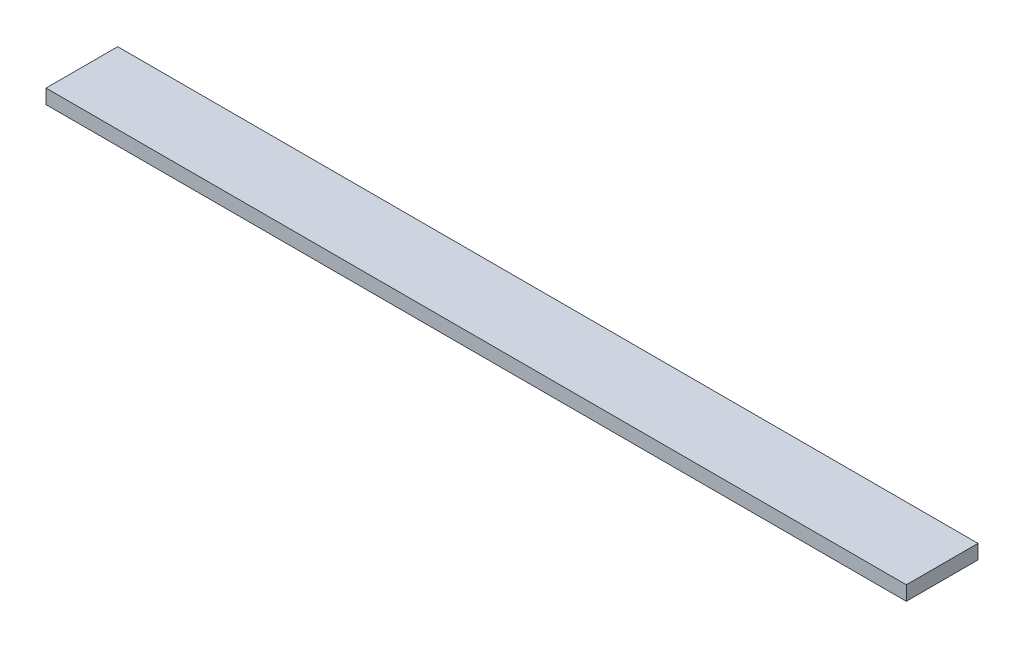
ISO-10303-21;
HEADER;
FILE_DESCRIPTION(('STEP AP214'),'2;1');
FILE_NAME('part.step','',(''),(''),'','','');
FILE_SCHEMA(('AUTOMOTIVE_DESIGN { 1 0 10303 214 1 1 1 1 }'));
ENDSEC;
DATA;
#1=APPLICATION_CONTEXT('core data for automotive mechanical design processes');
#2=APPLICATION_PROTOCOL_DEFINITION('international standard','automotive_design',2000,#1);
#3=PRODUCT_CONTEXT('',#1,'mechanical');
#4=PRODUCT('Part','Part','',(#3));
#5=PRODUCT_RELATED_PRODUCT_CATEGORY('part','',(#4));
#6=PRODUCT_DEFINITION_FORMATION('','',#4);
#7=PRODUCT_DEFINITION_CONTEXT('part definition',#1,'design');
#8=PRODUCT_DEFINITION('design','',#6,#7);
#9=PRODUCT_DEFINITION_SHAPE('','',#8);
#10=(LENGTH_UNIT() NAMED_UNIT(*) SI_UNIT(.MILLI.,.METRE.));
#11=(NAMED_UNIT(*) PLANE_ANGLE_UNIT() SI_UNIT($,.RADIAN.));
#12=(NAMED_UNIT(*) SI_UNIT($,.STERADIAN.) SOLID_ANGLE_UNIT());
#13=UNCERTAINTY_MEASURE_WITH_UNIT(LENGTH_MEASURE(1.E-05),#10,'distance_accuracy_value','');
#14=(GEOMETRIC_REPRESENTATION_CONTEXT(3) GLOBAL_UNCERTAINTY_ASSIGNED_CONTEXT((#13)) GLOBAL_UNIT_ASSIGNED_CONTEXT((#10,
#11,#12)) REPRESENTATION_CONTEXT('',''));
#15=CARTESIAN_POINT('',(0.,0.,0.));
#16=DIRECTION('',(0.,0.,1.));
#17=DIRECTION('',(1.,0.,0.));
#18=AXIS2_PLACEMENT_3D('',#15,#16,#17);
#19=CARTESIAN_POINT('',(0.,2.,0.));
#20=DIRECTION('',(1.,0.,0.));
#21=DIRECTION('',(0.,0.,-1.));
#22=AXIS2_PLACEMENT_3D('',#19,#20,#21);
#23=PLANE('',#22);
#24=DIRECTION('',(0.,0.,1.));
#25=VECTOR('',#24,1.);
#26=CARTESIAN_POINT('',(0.,0.,0.));
#27=LINE('',#26,#25);
#28=CARTESIAN_POINT('',(0.,0.,-10.));
#29=VERTEX_POINT('',#28);
#30=CARTESIAN_POINT('',(0.,0.,0.));
#31=VERTEX_POINT('',#30);
#32=EDGE_CURVE('E107',#29,#31,#27,.T.);
#33=ORIENTED_EDGE('',*,*,#32,.T.);
#34=DIRECTION('',(0.,-1.,0.));
#35=VECTOR('',#34,1.);
#36=CARTESIAN_POINT('',(0.,2.,0.));
#37=LINE('',#36,#35);
#38=CARTESIAN_POINT('',(0.,2.,0.));
#39=VERTEX_POINT('',#38);
#40=EDGE_CURVE('E11',#39,#31,#37,.T.);
#41=ORIENTED_EDGE('',*,*,#40,.F.);
#42=DIRECTION('',(0.,0.,1.));
#43=VECTOR('',#42,1.);
#44=CARTESIAN_POINT('',(0.,2.,0.));
#45=LINE('',#44,#43);
#46=CARTESIAN_POINT('',(0.,2.,-10.));
#47=VERTEX_POINT('',#46);
#48=EDGE_CURVE('E91',#47,#39,#45,.T.);
#49=ORIENTED_EDGE('',*,*,#48,.F.);
#50=DIRECTION('',(0.,-1.,0.));
#51=VECTOR('',#50,1.);
#52=CARTESIAN_POINT('',(0.,2.,-10.));
#53=LINE('',#52,#51);
#54=EDGE_CURVE('E103',#47,#29,#53,.T.);
#55=ORIENTED_EDGE('',*,*,#54,.T.);
#56=EDGE_LOOP('',(#33,#41,#49,#55));
#57=FACE_BOUND('',#56,.T.);
#58=ADVANCED_FACE('F39',(#57),#23,.F.);
#59=CARTESIAN_POINT('',(0.,2.,0.));
#60=DIRECTION('',(0.,0.,-1.));
#61=DIRECTION('',(-1.,0.,0.));
#62=AXIS2_PLACEMENT_3D('',#59,#60,#61);
#63=PLANE('',#62);
#64=DIRECTION('',(1.,0.,0.));
#65=VECTOR('',#64,1.);
#66=CARTESIAN_POINT('',(0.,0.,0.));
#67=LINE('',#66,#65);
#68=CARTESIAN_POINT('',(120.,0.,0.));
#69=VERTEX_POINT('',#68);
#70=EDGE_CURVE('E96',#31,#69,#67,.T.);
#71=ORIENTED_EDGE('',*,*,#70,.T.);
#72=DIRECTION('',(0.,-1.,0.));
#73=VECTOR('',#72,1.);
#74=CARTESIAN_POINT('',(120.,2.,0.));
#75=LINE('',#74,#73);
#76=CARTESIAN_POINT('',(120.,2.,0.));
#77=VERTEX_POINT('',#76);
#78=EDGE_CURVE('E48',#77,#69,#75,.T.);
#79=ORIENTED_EDGE('',*,*,#78,.F.);
#80=DIRECTION('',(1.,0.,0.));
#81=VECTOR('',#80,1.);
#82=CARTESIAN_POINT('',(0.,2.,0.));
#83=LINE('',#82,#81);
#84=EDGE_CURVE('E86',#39,#77,#83,.T.);
#85=ORIENTED_EDGE('',*,*,#84,.F.);
#86=ORIENTED_EDGE('',*,*,#40,.T.);
#87=EDGE_LOOP('',(#71,#79,#85,#86));
#88=FACE_BOUND('',#87,.T.);
#89=ADVANCED_FACE('F95',(#88),#63,.F.);
#90=CARTESIAN_POINT('',(120.,2.,0.));
#91=DIRECTION('',(-1.,0.,0.));
#92=DIRECTION('',(0.,0.,1.));
#93=AXIS2_PLACEMENT_3D('',#90,#91,#92);
#94=PLANE('',#93);
#95=DIRECTION('',(0.,0.,-1.));
#96=VECTOR('',#95,1.);
#97=CARTESIAN_POINT('',(120.,0.,0.));
#98=LINE('',#97,#96);
#99=CARTESIAN_POINT('',(120.,0.,-10.));
#100=VERTEX_POINT('',#99);
#101=EDGE_CURVE('E73',#69,#100,#98,.T.);
#102=ORIENTED_EDGE('',*,*,#101,.T.);
#103=DIRECTION('',(0.,-1.,0.));
#104=VECTOR('',#103,1.);
#105=CARTESIAN_POINT('',(120.,2.,-10.));
#106=LINE('',#105,#104);
#107=CARTESIAN_POINT('',(120.,2.,-10.));
#108=VERTEX_POINT('',#107);
#109=EDGE_CURVE('E98',#108,#100,#106,.T.);
#110=ORIENTED_EDGE('',*,*,#109,.F.);
#111=DIRECTION('',(0.,0.,-1.));
#112=VECTOR('',#111,1.);
#113=CARTESIAN_POINT('',(120.,2.,0.));
#114=LINE('',#113,#112);
#115=EDGE_CURVE('E89',#77,#108,#114,.T.);
#116=ORIENTED_EDGE('',*,*,#115,.F.);
#117=ORIENTED_EDGE('',*,*,#78,.T.);
#118=EDGE_LOOP('',(#102,#110,#116,#117));
#119=FACE_BOUND('',#118,.T.);
#120=ADVANCED_FACE('F99',(#119),#94,.F.);
#121=CARTESIAN_POINT('',(0.,2.,-10.));
#122=DIRECTION('',(0.,0.,1.));
#123=DIRECTION('',(1.,0.,0.));
#124=AXIS2_PLACEMENT_3D('',#121,#122,#123);
#125=PLANE('',#124);
#126=DIRECTION('',(-1.,0.,0.));
#127=VECTOR('',#126,1.);
#128=CARTESIAN_POINT('',(0.,0.,-10.));
#129=LINE('',#128,#127);
#130=EDGE_CURVE('E79',#100,#29,#129,.T.);
#131=ORIENTED_EDGE('',*,*,#130,.T.);
#132=ORIENTED_EDGE('',*,*,#54,.F.);
#133=DIRECTION('',(-1.,0.,0.));
#134=VECTOR('',#133,1.);
#135=CARTESIAN_POINT('',(0.,2.,-10.));
#136=LINE('',#135,#134);
#137=EDGE_CURVE('E56',#108,#47,#136,.T.);
#138=ORIENTED_EDGE('',*,*,#137,.F.);
#139=ORIENTED_EDGE('',*,*,#109,.T.);
#140=EDGE_LOOP('',(#131,#132,#138,#139));
#141=FACE_BOUND('',#140,.T.);
#142=ADVANCED_FACE('F120',(#141),#125,.F.);
#143=CARTESIAN_POINT('',(0.,2.,0.));
#144=DIRECTION('',(0.,-1.,0.));
#145=DIRECTION('',(0.,0.,-1.));
#146=AXIS2_PLACEMENT_3D('',#143,#144,#145);
#147=PLANE('',#146);
#148=ORIENTED_EDGE('',*,*,#48,.T.);
#149=ORIENTED_EDGE('',*,*,#84,.T.);
#150=ORIENTED_EDGE('',*,*,#115,.T.);
#151=ORIENTED_EDGE('',*,*,#137,.T.);
#152=EDGE_LOOP('',(#148,#149,#150,#151));
#153=FACE_BOUND('',#152,.T.);
#154=ADVANCED_FACE('F87',(#153),#147,.F.);
#155=CARTESIAN_POINT('',(0.,0.,0.));
#156=DIRECTION('',(0.,-1.,0.));
#157=DIRECTION('',(0.,0.,-1.));
#158=AXIS2_PLACEMENT_3D('',#155,#156,#157);
#159=PLANE('',#158);
#160=ORIENTED_EDGE('',*,*,#32,.F.);
#161=ORIENTED_EDGE('',*,*,#130,.F.);
#162=ORIENTED_EDGE('',*,*,#101,.F.);
#163=ORIENTED_EDGE('',*,*,#70,.F.);
#164=EDGE_LOOP('',(#160,#161,#162,#163));
#165=FACE_BOUND('',#164,.T.);
#166=ADVANCED_FACE('F123',(#165),#159,.T.);
#167=CLOSED_SHELL('',(#58,#89,#120,#142,#154,#166));
#168=MANIFOLD_SOLID_BREP('B2',#167);
#169=ADVANCED_BREP_SHAPE_REPRESENTATION('',(#18,#168),#14);
#170=SHAPE_DEFINITION_REPRESENTATION(#9,#169);
ENDSEC;
END-ISO-10303-21;
